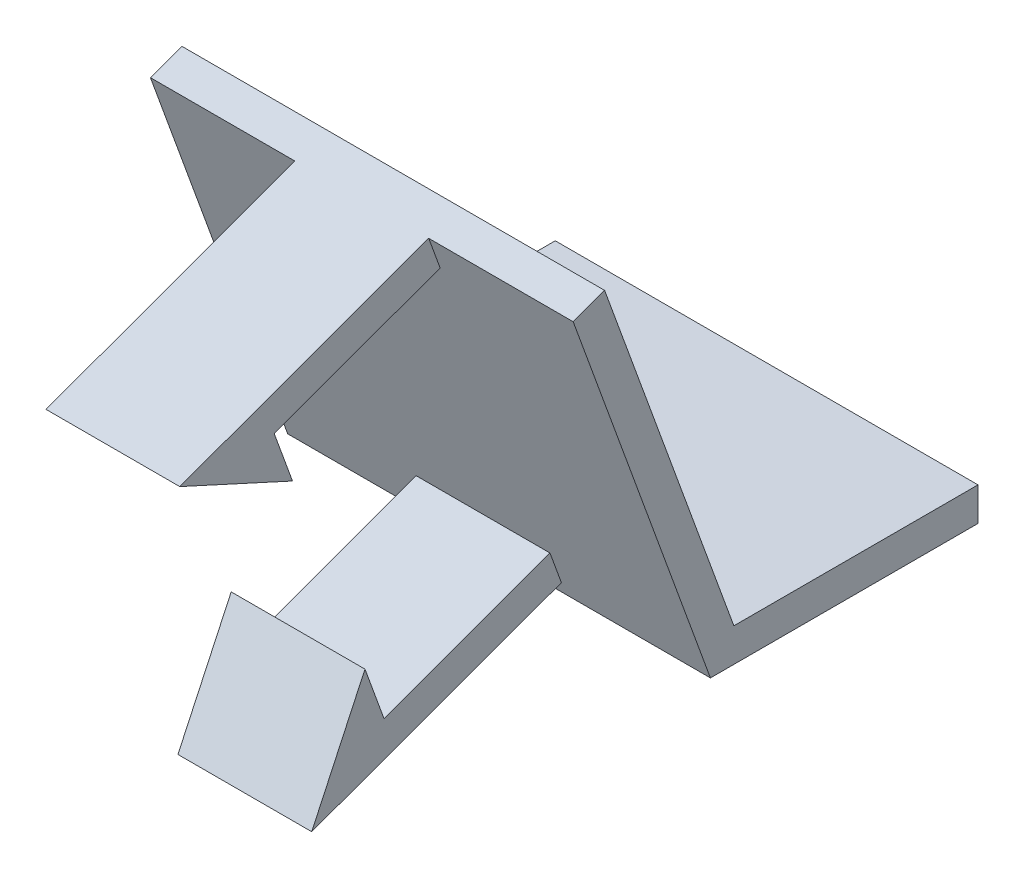
ISO-10303-21;
HEADER;
FILE_DESCRIPTION(('STEP AP214'),'2;1');
FILE_NAME('part.step','',(''),(''),'','','');
FILE_SCHEMA(('AUTOMOTIVE_DESIGN { 1 0 10303 214 1 1 1 1 }'));
ENDSEC;
DATA;
#1=APPLICATION_CONTEXT('core data for automotive mechanical design processes');
#2=APPLICATION_PROTOCOL_DEFINITION('international standard','automotive_design',2000,#1);
#3=PRODUCT_CONTEXT('',#1,'mechanical');
#4=PRODUCT('Part','Part','',(#3));
#5=PRODUCT_RELATED_PRODUCT_CATEGORY('part','',(#4));
#6=PRODUCT_DEFINITION_FORMATION('','',#4);
#7=PRODUCT_DEFINITION_CONTEXT('part definition',#1,'design');
#8=PRODUCT_DEFINITION('design','',#6,#7);
#9=PRODUCT_DEFINITION_SHAPE('','',#8);
#10=(LENGTH_UNIT() NAMED_UNIT(*) SI_UNIT(.MILLI.,.METRE.));
#11=(NAMED_UNIT(*) PLANE_ANGLE_UNIT() SI_UNIT($,.RADIAN.));
#12=(NAMED_UNIT(*) SI_UNIT($,.STERADIAN.) SOLID_ANGLE_UNIT());
#13=UNCERTAINTY_MEASURE_WITH_UNIT(LENGTH_MEASURE(1.E-05),#10,'distance_accuracy_value','');
#14=(GEOMETRIC_REPRESENTATION_CONTEXT(3) GLOBAL_UNCERTAINTY_ASSIGNED_CONTEXT((#13)) GLOBAL_UNIT_ASSIGNED_CONTEXT((#10,
#11,#12)) REPRESENTATION_CONTEXT('',''));
#15=CARTESIAN_POINT('',(0.,0.,0.));
#16=DIRECTION('',(0.,0.,1.));
#17=DIRECTION('',(1.,0.,0.));
#18=AXIS2_PLACEMENT_3D('',#15,#16,#17);
#19=CARTESIAN_POINT('',(-58.4378245614035,0.,1.07957426900583));
#20=DIRECTION('',(0.,-0.342020143325663,0.93969262078591));
#21=DIRECTION('',(0.,-0.939692620785911,-0.342020143325663));
#22=AXIS2_PLACEMENT_3D('',#19,#20,#21);
#23=PLANE('',#22);
#24=DIRECTION('',(1.,0.,0.));
#25=VECTOR('',#24,1.);
#26=CARTESIAN_POINT('',(-44.7218245614035,32.8187647809479,13.0246277746546));
#27=LINE('',#26,#25);
#28=CARTESIAN_POINT('',(-44.7218245614035,32.8187647809479,13.0246277746546));
#29=VERTEX_POINT('',#28);
#30=CARTESIAN_POINT('',(-32.0218245614035,32.8187647809479,13.0246277746546));
#31=VERTEX_POINT('',#30);
#32=EDGE_CURVE('E218',#29,#31,#27,.T.);
#33=ORIENTED_EDGE('',*,*,#32,.F.);
#34=DIRECTION('',(0.,-0.939692620785911,-0.342020143325663));
#35=VECTOR('',#34,1.);
#36=CARTESIAN_POINT('',(-44.7218245614035,35.8022888519432,14.1105417297136));
#37=LINE('',#36,#35);
#38=CARTESIAN_POINT('',(-44.7218245614035,35.8022888519432,14.1105417297136));
#39=VERTEX_POINT('',#38);
#40=EDGE_CURVE('E210',#39,#29,#37,.T.);
#41=ORIENTED_EDGE('',*,*,#40,.F.);
#42=DIRECTION('',(1.,0.,0.));
#43=VECTOR('',#42,1.);
#44=CARTESIAN_POINT('',(-58.4378245614035,35.8022888519432,14.1105417297136));
#45=LINE('',#44,#43);
#46=CARTESIAN_POINT('',(-58.4378245614035,35.8022888519432,14.1105417297136));
#47=VERTEX_POINT('',#46);
#48=EDGE_CURVE('E247',#47,#39,#45,.T.);
#49=ORIENTED_EDGE('',*,*,#48,.F.);
#50=DIRECTION('',(0.,-0.93969262078591,-0.342020143325663));
#51=VECTOR('',#50,1.);
#52=CARTESIAN_POINT('',(-58.4378245614035,0.,1.07957426900583));
#53=LINE('',#52,#51);
#54=CARTESIAN_POINT('',(-58.4378245614035,0.,1.07957426900584));
#55=VERTEX_POINT('',#54);
#56=EDGE_CURVE('E236',#47,#55,#53,.T.);
#57=ORIENTED_EDGE('',*,*,#56,.T.);
#58=DIRECTION('',(1.,0.,0.));
#59=VECTOR('',#58,1.);
#60=CARTESIAN_POINT('',(-58.4378245614035,0.,1.07957426900584));
#61=LINE('',#60,#59);
#62=CARTESIAN_POINT('',(-18.3058245614035,0.,1.07957426900584));
#63=VERTEX_POINT('',#62);
#64=EDGE_CURVE('E264',#55,#63,#61,.T.);
#65=ORIENTED_EDGE('',*,*,#64,.T.);
#66=DIRECTION('',(0.,-0.93969262078591,-0.342020143325663));
#67=VECTOR('',#66,1.);
#68=CARTESIAN_POINT('',(-18.3058245614035,0.,1.07957426900584));
#69=LINE('',#68,#67);
#70=CARTESIAN_POINT('',(-18.3058245614035,35.8022888519432,14.1105417297136));
#71=VERTEX_POINT('',#70);
#72=EDGE_CURVE('E233',#71,#63,#69,.T.);
#73=ORIENTED_EDGE('',*,*,#72,.F.);
#74=CARTESIAN_POINT('',(-32.0218245614035,35.8022888519432,14.1105417297136));
#75=VERTEX_POINT('',#74);
#76=EDGE_CURVE('E251',#75,#71,#45,.T.);
#77=ORIENTED_EDGE('',*,*,#76,.F.);
#78=DIRECTION('',(0.,0.939692620785911,0.342020143325663));
#79=VECTOR('',#78,1.);
#80=CARTESIAN_POINT('',(-32.0218245614035,35.8022888519432,14.1105417297136));
#81=LINE('',#80,#79);
#82=EDGE_CURVE('E215',#31,#75,#81,.T.);
#83=ORIENTED_EDGE('',*,*,#82,.F.);
#84=EDGE_LOOP('',(#33,#41,#49,#57,#65,#73,#77,#83));
#85=FACE_BOUND('',#84,.T.);
#86=DIRECTION('',(1.,0.,0.));
#87=VECTOR('',#86,1.);
#88=CARTESIAN_POINT('',(-44.7218245614035,1.19340962839812,1.51393985102943));
#89=LINE('',#88,#87);
#90=CARTESIAN_POINT('',(-44.7218245614035,1.19340962839812,1.51393985102943));
#91=VERTEX_POINT('',#90);
#92=CARTESIAN_POINT('',(-32.0218245614035,1.19340962839812,1.51393985102944));
#93=VERTEX_POINT('',#92);
#94=EDGE_CURVE('E152',#91,#93,#89,.T.);
#95=ORIENTED_EDGE('',*,*,#94,.F.);
#96=DIRECTION('',(0.,-0.93969262078591,-0.342020143325663));
#97=VECTOR('',#96,1.);
#98=CARTESIAN_POINT('',(-44.7218245614035,4.17693369939338,2.59985380608841));
#99=LINE('',#98,#97);
#100=CARTESIAN_POINT('',(-44.7218245614035,4.17693369939338,2.59985380608841));
#101=VERTEX_POINT('',#100);
#102=EDGE_CURVE('E192',#101,#91,#99,.T.);
#103=ORIENTED_EDGE('',*,*,#102,.F.);
#104=DIRECTION('',(-1.,0.,0.));
#105=VECTOR('',#104,1.);
#106=CARTESIAN_POINT('',(-44.7218245614035,4.17693369939338,2.59985380608841));
#107=LINE('',#106,#105);
#108=CARTESIAN_POINT('',(-32.0218245614035,4.17693369939338,2.59985380608842));
#109=VERTEX_POINT('',#108);
#110=EDGE_CURVE('E199',#109,#101,#107,.T.);
#111=ORIENTED_EDGE('',*,*,#110,.F.);
#112=DIRECTION('',(0.,0.93969262078591,0.342020143325663));
#113=VECTOR('',#112,1.);
#114=CARTESIAN_POINT('',(-32.0218245614035,4.17693369939338,2.59985380608842));
#115=LINE('',#114,#113);
#116=EDGE_CURVE('E203',#93,#109,#115,.T.);
#117=ORIENTED_EDGE('',*,*,#116,.F.);
#118=EDGE_LOOP('',(#95,#103,#111,#117));
#119=FACE_BOUND('',#118,.T.);
#120=ADVANCED_FACE('F33',(#85,#119),#23,.T.);
#121=CARTESIAN_POINT('',(-58.4378245614035,3.175,-24.3204257309942));
#122=DIRECTION('',(1.,0.,0.));
#123=DIRECTION('',(0.,0.,-1.));
#124=AXIS2_PLACEMENT_3D('',#121,#122,#123);
#125=PLANE('',#124);
#126=DIRECTION('',(0.,0.,1.));
#127=VECTOR('',#126,1.);
#128=CARTESIAN_POINT('',(-58.4378245614035,0.,-24.3204257309942));
#129=LINE('',#128,#127);
#130=CARTESIAN_POINT('',(-58.4378245614035,0.,-24.3204257309942));
#131=VERTEX_POINT('',#130);
#132=EDGE_CURVE('E250',#131,#55,#129,.T.);
#133=ORIENTED_EDGE('',*,*,#132,.T.);
#134=ORIENTED_EDGE('',*,*,#56,.F.);
#135=DIRECTION('',(0.,-0.342020143325662,0.939692620785911));
#136=VECTOR('',#135,1.);
#137=CARTESIAN_POINT('',(-58.4378245614035,35.8022888519432,14.1105417297136));
#138=LINE('',#137,#136);
#139=CARTESIAN_POINT('',(-58.4378245614035,36.8882028070022,11.1270176587183));
#140=VERTEX_POINT('',#139);
#141=EDGE_CURVE('E232',#140,#47,#138,.T.);
#142=ORIENTED_EDGE('',*,*,#141,.F.);
#143=DIRECTION('',(0.,0.93969262078591,0.342020143325663));
#144=VECTOR('',#143,1.);
#145=CARTESIAN_POINT('',(-58.4378245614035,36.8882028070022,11.1270176587183));
#146=LINE('',#145,#144);
#147=CARTESIAN_POINT('',(-58.4378245614035,3.175,-1.14358466481002));
#148=VERTEX_POINT('',#147);
#149=EDGE_CURVE('E229',#148,#140,#146,.T.);
#150=ORIENTED_EDGE('',*,*,#149,.F.);
#151=DIRECTION('',(0.,0.,1.));
#152=VECTOR('',#151,1.);
#153=CARTESIAN_POINT('',(-58.4378245614035,3.175,-24.3204257309942));
#154=LINE('',#153,#152);
#155=CARTESIAN_POINT('',(-58.4378245614035,3.175,-24.3204257309942));
#156=VERTEX_POINT('',#155);
#157=EDGE_CURVE('E255',#156,#148,#154,.T.);
#158=ORIENTED_EDGE('',*,*,#157,.F.);
#159=DIRECTION('',(0.,-1.,0.));
#160=VECTOR('',#159,1.);
#161=CARTESIAN_POINT('',(-58.4378245614035,3.175,-24.3204257309942));
#162=LINE('',#161,#160);
#163=EDGE_CURVE('E41',#156,#131,#162,.T.);
#164=ORIENTED_EDGE('',*,*,#163,.T.);
#165=EDGE_LOOP('',(#133,#134,#142,#150,#158,#164));
#166=FACE_BOUND('',#165,.T.);
#167=ADVANCED_FACE('F35',(#166),#125,.F.);
#168=CARTESIAN_POINT('',(-18.3058245614035,3.175,-24.3204257309941));
#169=DIRECTION('',(-1.,0.,0.));
#170=DIRECTION('',(0.,0.,1.));
#171=AXIS2_PLACEMENT_3D('',#168,#169,#170);
#172=PLANE('',#171);
#173=ORIENTED_EDGE('',*,*,#72,.T.);
#174=DIRECTION('',(0.,0.,-1.));
#175=VECTOR('',#174,1.);
#176=CARTESIAN_POINT('',(-18.3058245614035,0.,-24.3204257309941));
#177=LINE('',#176,#175);
#178=CARTESIAN_POINT('',(-18.3058245614035,0.,-24.3204257309941));
#179=VERTEX_POINT('',#178);
#180=EDGE_CURVE('E267',#63,#179,#177,.T.);
#181=ORIENTED_EDGE('',*,*,#180,.T.);
#182=DIRECTION('',(0.,-1.,0.));
#183=VECTOR('',#182,1.);
#184=CARTESIAN_POINT('',(-18.3058245614035,3.175,-24.3204257309941));
#185=LINE('',#184,#183);
#186=CARTESIAN_POINT('',(-18.3058245614035,3.175,-24.3204257309941));
#187=VERTEX_POINT('',#186);
#188=EDGE_CURVE('E11',#187,#179,#185,.T.);
#189=ORIENTED_EDGE('',*,*,#188,.F.);
#190=DIRECTION('',(0.,0.,-1.));
#191=VECTOR('',#190,1.);
#192=CARTESIAN_POINT('',(-18.3058245614035,3.175,-24.3204257309941));
#193=LINE('',#192,#191);
#194=CARTESIAN_POINT('',(-18.3058245614035,3.175,-1.14358466481001));
#195=VERTEX_POINT('',#194);
#196=EDGE_CURVE('E257',#195,#187,#193,.T.);
#197=ORIENTED_EDGE('',*,*,#196,.F.);
#198=DIRECTION('',(0.,0.93969262078591,0.342020143325663));
#199=VECTOR('',#198,1.);
#200=CARTESIAN_POINT('',(-18.3058245614035,36.8882028070022,11.1270176587183));
#201=LINE('',#200,#199);
#202=CARTESIAN_POINT('',(-18.3058245614035,36.8882028070022,11.1270176587183));
#203=VERTEX_POINT('',#202);
#204=EDGE_CURVE('E228',#195,#203,#201,.T.);
#205=ORIENTED_EDGE('',*,*,#204,.T.);
#206=DIRECTION('',(0.,-0.342020143325662,0.939692620785911));
#207=VECTOR('',#206,1.);
#208=CARTESIAN_POINT('',(-18.3058245614035,35.8022888519432,14.1105417297136));
#209=LINE('',#208,#207);
#210=EDGE_CURVE('E242',#203,#71,#209,.T.);
#211=ORIENTED_EDGE('',*,*,#210,.T.);
#212=EDGE_LOOP('',(#173,#181,#189,#197,#205,#211));
#213=FACE_BOUND('',#212,.T.);
#214=ADVANCED_FACE('F287',(#213),#172,.F.);
#215=CARTESIAN_POINT('',(-58.4378245614035,3.175,-24.3204257309942));
#216=DIRECTION('',(0.,0.,1.));
#217=DIRECTION('',(1.,0.,0.));
#218=AXIS2_PLACEMENT_3D('',#215,#216,#217);
#219=PLANE('',#218);
#220=DIRECTION('',(-1.,0.,0.));
#221=VECTOR('',#220,1.);
#222=CARTESIAN_POINT('',(-58.4378245614035,0.,-24.3204257309942));
#223=LINE('',#222,#221);
#224=EDGE_CURVE('E258',#179,#131,#223,.T.);
#225=ORIENTED_EDGE('',*,*,#224,.T.);
#226=ORIENTED_EDGE('',*,*,#163,.F.);
#227=DIRECTION('',(-1.,0.,0.));
#228=VECTOR('',#227,1.);
#229=CARTESIAN_POINT('',(-58.4378245614035,3.175,-24.3204257309942));
#230=LINE('',#229,#228);
#231=EDGE_CURVE('E260',#187,#156,#230,.T.);
#232=ORIENTED_EDGE('',*,*,#231,.F.);
#233=ORIENTED_EDGE('',*,*,#188,.T.);
#234=EDGE_LOOP('',(#225,#226,#232,#233));
#235=FACE_BOUND('',#234,.T.);
#236=ADVANCED_FACE('F315',(#235),#219,.F.);
#237=CARTESIAN_POINT('',(0.,3.175,0.));
#238=DIRECTION('',(0.,1.,0.));
#239=DIRECTION('',(0.,0.,1.));
#240=AXIS2_PLACEMENT_3D('',#237,#238,#239);
#241=PLANE('',#240);
#242=DIRECTION('',(1.,0.,0.));
#243=VECTOR('',#242,1.);
#244=CARTESIAN_POINT('',(-58.4378245614035,3.175,-1.14358466481002));
#245=LINE('',#244,#243);
#246=EDGE_CURVE('E239',#148,#195,#245,.T.);
#247=ORIENTED_EDGE('',*,*,#246,.T.);
#248=ORIENTED_EDGE('',*,*,#196,.T.);
#249=ORIENTED_EDGE('',*,*,#231,.T.);
#250=ORIENTED_EDGE('',*,*,#157,.T.);
#251=EDGE_LOOP('',(#247,#248,#249,#250));
#252=FACE_BOUND('',#251,.T.);
#253=ADVANCED_FACE('F314',(#252),#241,.T.);
#254=CARTESIAN_POINT('',(0.,0.,0.));
#255=DIRECTION('',(0.,1.,0.));
#256=DIRECTION('',(0.,0.,1.));
#257=AXIS2_PLACEMENT_3D('',#254,#255,#256);
#258=PLANE('',#257);
#259=ORIENTED_EDGE('',*,*,#132,.F.);
#260=ORIENTED_EDGE('',*,*,#224,.F.);
#261=ORIENTED_EDGE('',*,*,#180,.F.);
#262=ORIENTED_EDGE('',*,*,#64,.F.);
#263=EDGE_LOOP('',(#259,#260,#261,#262));
#264=FACE_BOUND('',#263,.T.);
#265=ADVANCED_FACE('F280',(#264),#258,.F.);
#266=CARTESIAN_POINT('',(-58.4378245614035,35.8022888519432,14.1105417297136));
#267=DIRECTION('',(0.,0.939692620785911,0.342020143325663));
#268=DIRECTION('',(0.,-0.342020143325663,0.939692620785911));
#269=AXIS2_PLACEMENT_3D('',#266,#267,#268);
#270=PLANE('',#269);
#271=ORIENTED_EDGE('',*,*,#210,.F.);
#272=DIRECTION('',(1.,0.,0.));
#273=VECTOR('',#272,1.);
#274=CARTESIAN_POINT('',(-58.4378245614035,36.8882028070022,11.1270176587183));
#275=LINE('',#274,#273);
#276=EDGE_CURVE('E252',#140,#203,#275,.T.);
#277=ORIENTED_EDGE('',*,*,#276,.F.);
#278=ORIENTED_EDGE('',*,*,#141,.T.);
#279=ORIENTED_EDGE('',*,*,#48,.T.);
#280=DIRECTION('',(0.,0.342020143325663,-0.93969262078591));
#281=VECTOR('',#280,1.);
#282=CARTESIAN_POINT('',(-44.7218245614035,30.0686631692318,29.8635488245686));
#283=LINE('',#282,#281);
#284=CARTESIAN_POINT('',(-44.7218245614035,27.2018503278761,37.7400523719961));
#285=VERTEX_POINT('',#284);
#286=EDGE_CURVE('E214',#285,#39,#283,.T.);
#287=ORIENTED_EDGE('',*,*,#286,.F.);
#288=DIRECTION('',(-1.,0.,0.));
#289=VECTOR('',#288,1.);
#290=CARTESIAN_POINT('',(-32.0218245614035,27.2018503278761,37.7400523719961));
#291=LINE('',#290,#289);
#292=CARTESIAN_POINT('',(-32.0218245614035,27.2018503278761,37.7400523719961));
#293=VERTEX_POINT('',#292);
#294=EDGE_CURVE('E189',#293,#285,#291,.T.);
#295=ORIENTED_EDGE('',*,*,#294,.F.);
#296=DIRECTION('',(0.,0.342020143325663,-0.93969262078591));
#297=VECTOR('',#296,1.);
#298=CARTESIAN_POINT('',(-32.0218245614035,30.0686631692318,29.8635488245686));
#299=LINE('',#298,#297);
#300=EDGE_CURVE('E56',#293,#75,#299,.T.);
#301=ORIENTED_EDGE('',*,*,#300,.T.);
#302=ORIENTED_EDGE('',*,*,#76,.T.);
#303=EDGE_LOOP('',(#271,#277,#278,#279,#287,#295,#301,#302));
#304=FACE_BOUND('',#303,.T.);
#305=ADVANCED_FACE('F292',(#304),#270,.T.);
#306=CARTESIAN_POINT('',(-58.4378245614035,36.8882028070022,11.1270176587183));
#307=DIRECTION('',(0.,0.342020143325663,-0.93969262078591));
#308=DIRECTION('',(0.,0.93969262078591,0.342020143325663));
#309=AXIS2_PLACEMENT_3D('',#306,#307,#308);
#310=PLANE('',#309);
#311=ORIENTED_EDGE('',*,*,#204,.F.);
#312=ORIENTED_EDGE('',*,*,#246,.F.);
#313=ORIENTED_EDGE('',*,*,#149,.T.);
#314=ORIENTED_EDGE('',*,*,#276,.T.);
#315=EDGE_LOOP('',(#311,#312,#313,#314));
#316=FACE_BOUND('',#315,.T.);
#317=ADVANCED_FACE('F312',(#316),#310,.T.);
#318=CARTESIAN_POINT('',(-44.7218245614035,30.0686631692318,29.8635488245686));
#319=DIRECTION('',(1.,0.,0.));
#320=DIRECTION('',(0.,0.,-1.));
#321=AXIS2_PLACEMENT_3D('',#318,#319,#320);
#322=PLANE('',#321);
#323=ORIENTED_EDGE('',*,*,#40,.T.);
#324=DIRECTION('',(0.,0.342020143325663,-0.93969262078591));
#325=VECTOR('',#324,1.);
#326=CARTESIAN_POINT('',(-44.7218245614035,27.0851390982365,28.7776348695096));
#327=LINE('',#326,#325);
#328=CARTESIAN_POINT('',(-44.7218245614035,27.0851390982365,28.7776348695096));
#329=VERTEX_POINT('',#328);
#330=EDGE_CURVE('E226',#329,#29,#327,.T.);
#331=ORIENTED_EDGE('',*,*,#330,.F.);
#332=DIRECTION('',(0.,-0.93969262078591,-0.342020143325664));
#333=VECTOR('',#332,1.);
#334=CARTESIAN_POINT('',(-44.7218245614035,22.3115005846441,27.0401725414153));
#335=LINE('',#334,#333);
#336=CARTESIAN_POINT('',(-44.7218245614035,22.3115005846441,27.0401725414153));
#337=VERTEX_POINT('',#336);
#338=EDGE_CURVE('E177',#329,#337,#335,.T.);
#339=ORIENTED_EDGE('',*,*,#338,.T.);
#340=DIRECTION('',(0.,0.415687770454692,0.909507381770158));
#341=VECTOR('',#340,1.);
#342=CARTESIAN_POINT('',(-44.7218245614035,27.2018503278761,37.7400523719961));
#343=LINE('',#342,#341);
#344=EDGE_CURVE('E182',#337,#285,#343,.T.);
#345=ORIENTED_EDGE('',*,*,#344,.T.);
#346=ORIENTED_EDGE('',*,*,#286,.T.);
#347=EDGE_LOOP('',(#323,#331,#339,#345,#346));
#348=FACE_BOUND('',#347,.T.);
#349=ADVANCED_FACE('F309',(#348),#322,.F.);
#350=CARTESIAN_POINT('',(-44.7218245614035,27.0851390982365,28.7776348695096));
#351=DIRECTION('',(0.,0.93969262078591,0.342020143325663));
#352=DIRECTION('',(0.,-0.342020143325663,0.939692620785911));
#353=AXIS2_PLACEMENT_3D('',#350,#351,#352);
#354=PLANE('',#353);
#355=ORIENTED_EDGE('',*,*,#32,.T.);
#356=DIRECTION('',(0.,0.342020143325663,-0.93969262078591));
#357=VECTOR('',#356,1.);
#358=CARTESIAN_POINT('',(-32.0218245614035,27.0851390982365,28.7776348695096));
#359=LINE('',#358,#357);
#360=CARTESIAN_POINT('',(-32.0218245614035,27.0851390982365,28.7776348695096));
#361=VERTEX_POINT('',#360);
#362=EDGE_CURVE('E223',#361,#31,#359,.T.);
#363=ORIENTED_EDGE('',*,*,#362,.F.);
#364=DIRECTION('',(1.,0.,0.));
#365=VECTOR('',#364,1.);
#366=CARTESIAN_POINT('',(-44.7218245614035,27.0851390982365,28.7776348695096));
#367=LINE('',#366,#365);
#368=EDGE_CURVE('E211',#329,#361,#367,.T.);
#369=ORIENTED_EDGE('',*,*,#368,.F.);
#370=ORIENTED_EDGE('',*,*,#330,.T.);
#371=EDGE_LOOP('',(#355,#363,#369,#370));
#372=FACE_BOUND('',#371,.T.);
#373=ADVANCED_FACE('F301',(#372),#354,.F.);
#374=CARTESIAN_POINT('',(-32.0218245614035,30.0686631692318,29.8635488245686));
#375=DIRECTION('',(-1.,0.,0.));
#376=DIRECTION('',(0.,0.,1.));
#377=AXIS2_PLACEMENT_3D('',#374,#375,#376);
#378=PLANE('',#377);
#379=ORIENTED_EDGE('',*,*,#82,.T.);
#380=ORIENTED_EDGE('',*,*,#300,.F.);
#381=DIRECTION('',(0.,0.415687770454692,0.909507381770158));
#382=VECTOR('',#381,1.);
#383=CARTESIAN_POINT('',(-32.0218245614035,27.2018503278761,37.7400523719961));
#384=LINE('',#383,#382);
#385=CARTESIAN_POINT('',(-32.0218245614035,22.3115005846441,27.0401725414153));
#386=VERTEX_POINT('',#385);
#387=EDGE_CURVE('E181',#386,#293,#384,.T.);
#388=ORIENTED_EDGE('',*,*,#387,.F.);
#389=DIRECTION('',(0.,-0.93969262078591,-0.342020143325664));
#390=VECTOR('',#389,1.);
#391=CARTESIAN_POINT('',(-32.0218245614035,22.3115005846441,27.0401725414153));
#392=LINE('',#391,#390);
#393=EDGE_CURVE('E179',#361,#386,#392,.T.);
#394=ORIENTED_EDGE('',*,*,#393,.F.);
#395=ORIENTED_EDGE('',*,*,#362,.T.);
#396=EDGE_LOOP('',(#379,#380,#388,#394,#395));
#397=FACE_BOUND('',#396,.T.);
#398=ADVANCED_FACE('F297',(#397),#378,.F.);
#399=CARTESIAN_POINT('',(-44.7218245614035,-1.55669198331804,18.3528609009434));
#400=DIRECTION('',(1.,0.,0.));
#401=DIRECTION('',(0.,0.,-1.));
#402=AXIS2_PLACEMENT_3D('',#399,#400,#401);
#403=PLANE('',#402);
#404=ORIENTED_EDGE('',*,*,#102,.T.);
#405=DIRECTION('',(0.,0.342020143325663,-0.93969262078591));
#406=VECTOR('',#405,1.);
#407=CARTESIAN_POINT('',(-44.7218245614035,-4.5402160543133,17.2669469458844));
#408=LINE('',#407,#406);
#409=CARTESIAN_POINT('',(-44.7218245614035,-7.43309083059042,25.2150550710158));
#410=VERTEX_POINT('',#409);
#411=EDGE_CURVE('E156',#410,#91,#408,.T.);
#412=ORIENTED_EDGE('',*,*,#411,.F.);
#413=DIRECTION('',(0.,0.906307787036647,-0.422618261740705));
#414=VECTOR('',#413,1.);
#415=CARTESIAN_POINT('',(-44.7218245614035,3.40789207081808,20.1598217221616));
#416=LINE('',#415,#414);
#417=CARTESIAN_POINT('',(-44.7218245614035,3.40789207081808,20.1598217221616));
#418=VERTEX_POINT('',#417);
#419=EDGE_CURVE('E164',#410,#418,#416,.T.);
#420=ORIENTED_EDGE('',*,*,#419,.T.);
#421=DIRECTION('',(0.,-0.939692620785911,-0.342020143325663));
#422=VECTOR('',#421,1.);
#423=CARTESIAN_POINT('',(-44.7218245614035,-4.5402160543133,17.2669469458844));
#424=LINE('',#423,#422);
#425=CARTESIAN_POINT('',(-44.7218245614035,-1.55669198331803,18.3528609009434));
#426=VERTEX_POINT('',#425);
#427=EDGE_CURVE('E170',#418,#426,#424,.T.);
#428=ORIENTED_EDGE('',*,*,#427,.T.);
#429=DIRECTION('',(0.,0.342020143325663,-0.93969262078591));
#430=VECTOR('',#429,1.);
#431=CARTESIAN_POINT('',(-44.7218245614035,-1.55669198331804,18.3528609009434));
#432=LINE('',#431,#430);
#433=EDGE_CURVE('E198',#426,#101,#432,.T.);
#434=ORIENTED_EDGE('',*,*,#433,.T.);
#435=EDGE_LOOP('',(#404,#412,#420,#428,#434));
#436=FACE_BOUND('',#435,.T.);
#437=ADVANCED_FACE('F385',(#436),#403,.F.);
#438=CARTESIAN_POINT('',(-44.7218245614035,-4.5402160543133,17.2669469458844));
#439=DIRECTION('',(0.,0.93969262078591,0.342020143325663));
#440=DIRECTION('',(0.,-0.342020143325663,0.939692620785911));
#441=AXIS2_PLACEMENT_3D('',#438,#439,#440);
#442=PLANE('',#441);
#443=ORIENTED_EDGE('',*,*,#94,.T.);
#444=DIRECTION('',(0.,0.342020143325663,-0.93969262078591));
#445=VECTOR('',#444,1.);
#446=CARTESIAN_POINT('',(-32.0218245614035,-4.5402160543133,17.2669469458844));
#447=LINE('',#446,#445);
#448=CARTESIAN_POINT('',(-32.0218245614035,-7.43309083059042,25.2150550710158));
#449=VERTEX_POINT('',#448);
#450=EDGE_CURVE('E146',#449,#93,#447,.T.);
#451=ORIENTED_EDGE('',*,*,#450,.F.);
#452=DIRECTION('',(-1.,0.,0.));
#453=VECTOR('',#452,1.);
#454=CARTESIAN_POINT('',(-32.0218245614035,-7.43309083059042,25.2150550710158));
#455=LINE('',#454,#453);
#456=EDGE_CURVE('E149',#449,#410,#455,.T.);
#457=ORIENTED_EDGE('',*,*,#456,.T.);
#458=ORIENTED_EDGE('',*,*,#411,.T.);
#459=EDGE_LOOP('',(#443,#451,#457,#458));
#460=FACE_BOUND('',#459,.T.);
#461=ADVANCED_FACE('F148',(#460),#442,.F.);
#462=CARTESIAN_POINT('',(-32.0218245614035,-1.55669198331803,18.3528609009434));
#463=DIRECTION('',(-1.,0.,0.));
#464=DIRECTION('',(0.,0.,1.));
#465=AXIS2_PLACEMENT_3D('',#462,#463,#464);
#466=PLANE('',#465);
#467=ORIENTED_EDGE('',*,*,#116,.T.);
#468=DIRECTION('',(0.,0.342020143325663,-0.93969262078591));
#469=VECTOR('',#468,1.);
#470=CARTESIAN_POINT('',(-32.0218245614035,-1.55669198331803,18.3528609009434));
#471=LINE('',#470,#469);
#472=CARTESIAN_POINT('',(-32.0218245614035,-1.55669198331803,18.3528609009434));
#473=VERTEX_POINT('',#472);
#474=EDGE_CURVE('E48',#473,#109,#471,.T.);
#475=ORIENTED_EDGE('',*,*,#474,.F.);
#476=DIRECTION('',(0.,-0.939692620785911,-0.342020143325663));
#477=VECTOR('',#476,1.);
#478=CARTESIAN_POINT('',(-32.0218245614035,-4.5402160543133,17.2669469458844));
#479=LINE('',#478,#477);
#480=CARTESIAN_POINT('',(-32.0218245614035,3.40789207081808,20.1598217221616));
#481=VERTEX_POINT('',#480);
#482=EDGE_CURVE('E166',#481,#473,#479,.T.);
#483=ORIENTED_EDGE('',*,*,#482,.F.);
#484=DIRECTION('',(0.,0.906307787036647,-0.422618261740705));
#485=VECTOR('',#484,1.);
#486=CARTESIAN_POINT('',(-32.0218245614035,3.40789207081808,20.1598217221616));
#487=LINE('',#486,#485);
#488=EDGE_CURVE('E161',#449,#481,#487,.T.);
#489=ORIENTED_EDGE('',*,*,#488,.F.);
#490=ORIENTED_EDGE('',*,*,#450,.T.);
#491=EDGE_LOOP('',(#467,#475,#483,#489,#490));
#492=FACE_BOUND('',#491,.T.);
#493=ADVANCED_FACE('F168',(#492),#466,.F.);
#494=CARTESIAN_POINT('',(-44.7218245614035,-1.55669198331804,18.3528609009434));
#495=DIRECTION('',(0.,-0.93969262078591,-0.342020143325663));
#496=DIRECTION('',(0.,0.342020143325663,-0.939692620785911));
#497=AXIS2_PLACEMENT_3D('',#494,#495,#496);
#498=PLANE('',#497);
#499=ORIENTED_EDGE('',*,*,#110,.T.);
#500=ORIENTED_EDGE('',*,*,#433,.F.);
#501=DIRECTION('',(-1.,0.,0.));
#502=VECTOR('',#501,1.);
#503=CARTESIAN_POINT('',(-44.7218245614035,-1.55669198331804,18.3528609009434));
#504=LINE('',#503,#502);
#505=EDGE_CURVE('E195',#473,#426,#504,.T.);
#506=ORIENTED_EDGE('',*,*,#505,.F.);
#507=ORIENTED_EDGE('',*,*,#474,.T.);
#508=EDGE_LOOP('',(#499,#500,#506,#507));
#509=FACE_BOUND('',#508,.T.);
#510=ADVANCED_FACE('F364',(#509),#498,.F.);
#511=CARTESIAN_POINT('',(-32.0218245614035,22.3115005846441,27.0401725414153));
#512=DIRECTION('',(0.,0.342020143325664,-0.93969262078591));
#513=DIRECTION('',(0.,0.93969262078591,0.342020143325664));
#514=AXIS2_PLACEMENT_3D('',#511,#512,#513);
#515=PLANE('',#514);
#516=ORIENTED_EDGE('',*,*,#338,.F.);
#517=ORIENTED_EDGE('',*,*,#368,.T.);
#518=ORIENTED_EDGE('',*,*,#393,.T.);
#519=DIRECTION('',(-1.,0.,0.));
#520=VECTOR('',#519,1.);
#521=CARTESIAN_POINT('',(-32.0218245614035,22.3115005846441,27.0401725414153));
#522=LINE('',#521,#520);
#523=EDGE_CURVE('E185',#386,#337,#522,.T.);
#524=ORIENTED_EDGE('',*,*,#523,.T.);
#525=EDGE_LOOP('',(#516,#517,#518,#524));
#526=FACE_BOUND('',#525,.T.);
#527=ADVANCED_FACE('F305',(#526),#515,.T.);
#528=CARTESIAN_POINT('',(-32.0218245614035,27.2018503278761,37.7400523719961));
#529=DIRECTION('',(0.,-0.909507381770158,0.415687770454692));
#530=DIRECTION('',(0.,-0.415687770454692,-0.909507381770158));
#531=AXIS2_PLACEMENT_3D('',#528,#529,#530);
#532=PLANE('',#531);
#533=ORIENTED_EDGE('',*,*,#344,.F.);
#534=ORIENTED_EDGE('',*,*,#523,.F.);
#535=ORIENTED_EDGE('',*,*,#387,.T.);
#536=ORIENTED_EDGE('',*,*,#294,.T.);
#537=EDGE_LOOP('',(#533,#534,#535,#536));
#538=FACE_BOUND('',#537,.T.);
#539=ADVANCED_FACE('F409',(#538),#532,.T.);
#540=CARTESIAN_POINT('',(-32.0218245614035,-4.5402160543133,17.2669469458844));
#541=DIRECTION('',(0.,0.342020143325663,-0.93969262078591));
#542=DIRECTION('',(0.,0.939692620785911,0.342020143325663));
#543=AXIS2_PLACEMENT_3D('',#540,#541,#542);
#544=PLANE('',#543);
#545=ORIENTED_EDGE('',*,*,#482,.T.);
#546=ORIENTED_EDGE('',*,*,#505,.T.);
#547=ORIENTED_EDGE('',*,*,#427,.F.);
#548=DIRECTION('',(-1.,0.,0.));
#549=VECTOR('',#548,1.);
#550=CARTESIAN_POINT('',(-32.0218245614035,3.40789207081808,20.1598217221616));
#551=LINE('',#550,#549);
#552=EDGE_CURVE('E165',#481,#418,#551,.T.);
#553=ORIENTED_EDGE('',*,*,#552,.F.);
#554=EDGE_LOOP('',(#545,#546,#547,#553));
#555=FACE_BOUND('',#554,.T.);
#556=ADVANCED_FACE('F416',(#555),#544,.T.);
#557=CARTESIAN_POINT('',(-32.0218245614035,3.40789207081808,20.1598217221616));
#558=DIRECTION('',(0.,0.422618261740705,0.906307787036647));
#559=DIRECTION('',(0.,-0.906307787036647,0.422618261740705));
#560=AXIS2_PLACEMENT_3D('',#557,#558,#559);
#561=PLANE('',#560);
#562=ORIENTED_EDGE('',*,*,#419,.F.);
#563=ORIENTED_EDGE('',*,*,#456,.F.);
#564=ORIENTED_EDGE('',*,*,#488,.T.);
#565=ORIENTED_EDGE('',*,*,#552,.T.);
#566=EDGE_LOOP('',(#562,#563,#564,#565));
#567=FACE_BOUND('',#566,.T.);
#568=ADVANCED_FACE('F160',(#567),#561,.T.);
#569=CLOSED_SHELL('',(#120,#167,#214,#236,#253,#265,#305,#317,#349,#373,#398,#437,#461,#493,
#510,#527,#539,#556,#568));
#570=MANIFOLD_SOLID_BREP('B2',#569);
#571=ADVANCED_BREP_SHAPE_REPRESENTATION('',(#18,#570),#14);
#572=SHAPE_DEFINITION_REPRESENTATION(#9,#571);
ENDSEC;
END-ISO-10303-21;
